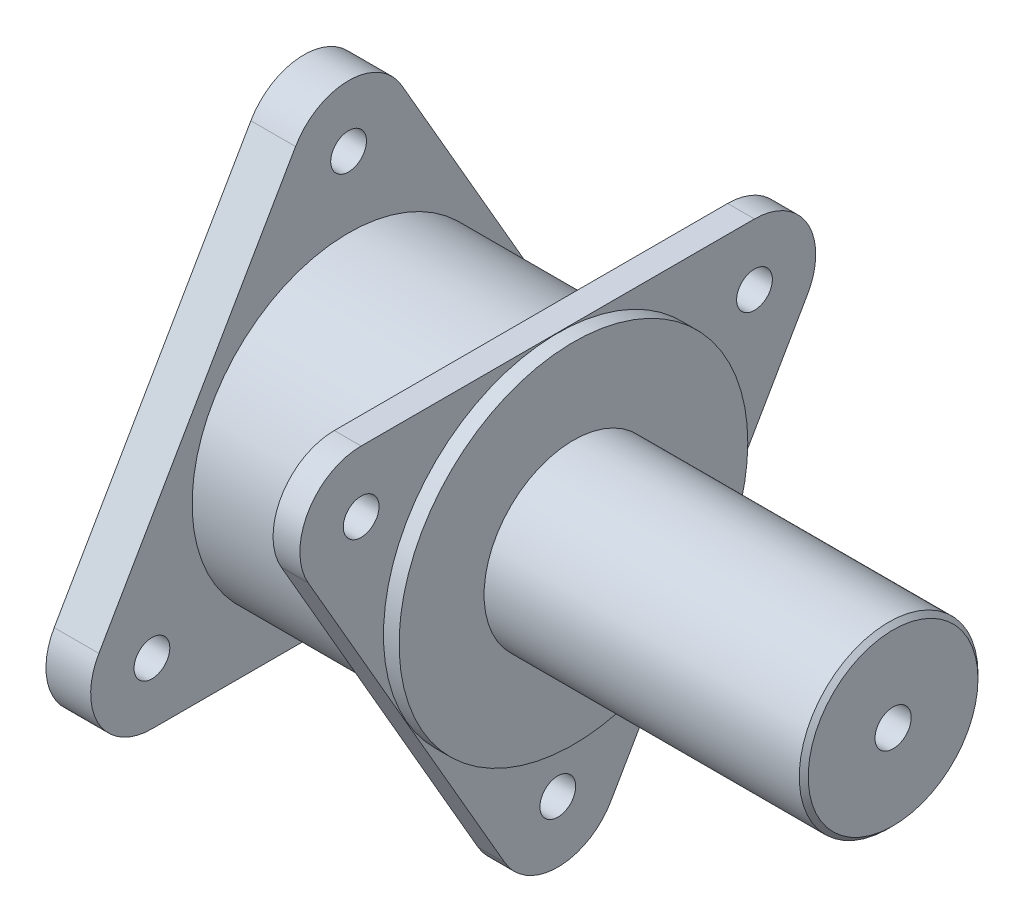
ISO-10303-21;
HEADER;
FILE_DESCRIPTION(('STEP AP214'),'2;1');
FILE_NAME('part.step','',(''),(''),'','','');
FILE_SCHEMA(('AUTOMOTIVE_DESIGN { 1 0 10303 214 1 1 1 1 }'));
ENDSEC;
DATA;
#1=APPLICATION_CONTEXT('core data for automotive mechanical design processes');
#2=APPLICATION_PROTOCOL_DEFINITION('international standard','automotive_design',2000,#1);
#3=PRODUCT_CONTEXT('',#1,'mechanical');
#4=PRODUCT('Part','Part','',(#3));
#5=PRODUCT_RELATED_PRODUCT_CATEGORY('part','',(#4));
#6=PRODUCT_DEFINITION_FORMATION('','',#4);
#7=PRODUCT_DEFINITION_CONTEXT('part definition',#1,'design');
#8=PRODUCT_DEFINITION('design','',#6,#7);
#9=PRODUCT_DEFINITION_SHAPE('','',#8);
#10=(LENGTH_UNIT() NAMED_UNIT(*) SI_UNIT(.MILLI.,.METRE.));
#11=(NAMED_UNIT(*) PLANE_ANGLE_UNIT() SI_UNIT($,.RADIAN.));
#12=(NAMED_UNIT(*) SI_UNIT($,.STERADIAN.) SOLID_ANGLE_UNIT());
#13=UNCERTAINTY_MEASURE_WITH_UNIT(LENGTH_MEASURE(1.E-05),#10,'distance_accuracy_value','');
#14=(GEOMETRIC_REPRESENTATION_CONTEXT(3) GLOBAL_UNCERTAINTY_ASSIGNED_CONTEXT((#13)) GLOBAL_UNIT_ASSIGNED_CONTEXT((#10,
#11,#12)) REPRESENTATION_CONTEXT('',''));
#15=CARTESIAN_POINT('',(0.,0.,0.));
#16=DIRECTION('',(0.,0.,1.));
#17=DIRECTION('',(1.,0.,0.));
#18=AXIS2_PLACEMENT_3D('',#15,#16,#17);
#19=CARTESIAN_POINT('',(10.,-25.3999999999981,43.9940905122478));
#20=DIRECTION('',(1.,0.,0.));
#21=DIRECTION('',(0.,0.,-1.));
#22=AXIS2_PLACEMENT_3D('',#19,#20,#21);
#23=PLANE('',#22);
#24=CARTESIAN_POINT('',(10.,0.,0.));
#25=DIRECTION('',(1.,0.,0.));
#26=DIRECTION('',(0.,0.,-1.));
#27=AXIS2_PLACEMENT_3D('',#24,#25,#26);
#28=CIRCLE('',#27,35.);
#29=CARTESIAN_POINT('',(10.,0.,-35.));
#30=VERTEX_POINT('',#29);
#31=EDGE_CURVE('E243',#30,#30,#28,.T.);
#32=ORIENTED_EDGE('',*,*,#31,.F.);
#33=EDGE_LOOP('',(#32));
#34=FACE_BOUND('',#33,.T.);
#35=CARTESIAN_POINT('',(10.,-25.3999999999981,-43.9940905122527));
#36=DIRECTION('',(1.,0.,0.));
#37=DIRECTION('',(0.,0.,-1.));
#38=AXIS2_PLACEMENT_3D('',#35,#36,#37);
#39=CIRCLE('',#38,4.00000000000278);
#40=CARTESIAN_POINT('',(10.,-25.3999999999981,-47.9940905122555));
#41=VERTEX_POINT('',#40);
#42=EDGE_CURVE('E228',#41,#41,#39,.T.);
#43=ORIENTED_EDGE('',*,*,#42,.F.);
#44=EDGE_LOOP('',(#43));
#45=FACE_BOUND('',#44,.T.);
#46=CARTESIAN_POINT('',(10.,-25.3999999999981,43.9940905122478));
#47=DIRECTION('',(1.,0.,0.));
#48=DIRECTION('',(0.,0.,-1.));
#49=AXIS2_PLACEMENT_3D('',#46,#47,#48);
#50=CIRCLE('',#49,13.6999999999999);
#51=CARTESIAN_POINT('',(10.,-18.5499999999976,55.8586385440946));
#52=VERTEX_POINT('',#51);
#53=CARTESIAN_POINT('',(10.,-39.0999999999976,43.9940905122478));
#54=VERTEX_POINT('',#53);
#55=EDGE_CURVE('E152',#52,#54,#50,.T.);
#56=ORIENTED_EDGE('',*,*,#55,.T.);
#57=DIRECTION('',(0.,0.,-1.));
#58=VECTOR('',#57,1.);
#59=CARTESIAN_POINT('',(10.,-39.0999999999976,43.9940905122478));
#60=LINE('',#59,#58);
#61=CARTESIAN_POINT('',(10.,-39.0999999999976,-43.9940905122487));
#62=VERTEX_POINT('',#61);
#63=EDGE_CURVE('E107',#54,#62,#60,.T.);
#64=ORIENTED_EDGE('',*,*,#63,.T.);
#65=CARTESIAN_POINT('',(10.,-25.3999999999976,-43.9940905122487));
#66=DIRECTION('',(1.,0.,0.));
#67=DIRECTION('',(0.,0.,-1.));
#68=AXIS2_PLACEMENT_3D('',#65,#66,#67);
#69=CIRCLE('',#68,13.7);
#70=CARTESIAN_POINT('',(10.,-18.5499999999975,-55.8586385440954));
#71=VERTEX_POINT('',#70);
#72=EDGE_CURVE('E123',#62,#71,#69,.T.);
#73=ORIENTED_EDGE('',*,*,#72,.T.);
#74=DIRECTION('',(0.,0.866025403784436,0.500000000000005));
#75=VECTOR('',#74,1.);
#76=CARTESIAN_POINT('',(10.,57.6500000000001,-11.8645480318468));
#77=LINE('',#76,#75);
#78=CARTESIAN_POINT('',(10.,57.6500000000001,-11.8645480318468));
#79=VERTEX_POINT('',#78);
#80=EDGE_CURVE('E117',#71,#79,#77,.T.);
#81=ORIENTED_EDGE('',*,*,#80,.T.);
#82=CARTESIAN_POINT('',(10.,50.8,0.));
#83=DIRECTION('',(1.,0.,0.));
#84=DIRECTION('',(0.,0.,-1.));
#85=AXIS2_PLACEMENT_3D('',#82,#83,#84);
#86=CIRCLE('',#85,13.7);
#87=CARTESIAN_POINT('',(10.,57.65,11.8645480318468));
#88=VERTEX_POINT('',#87);
#89=EDGE_CURVE('E121',#79,#88,#86,.T.);
#90=ORIENTED_EDGE('',*,*,#89,.T.);
#91=DIRECTION('',(0.,-0.86602540378444,0.499999999999998));
#92=VECTOR('',#91,1.);
#93=CARTESIAN_POINT('',(10.,-18.5499999999976,55.8586385440946));
#94=LINE('',#93,#92);
#95=EDGE_CURVE('E68',#88,#52,#94,.T.);
#96=ORIENTED_EDGE('',*,*,#95,.T.);
#97=EDGE_LOOP('',(#56,#64,#73,#81,#90,#96));
#98=FACE_BOUND('',#97,.T.);
#99=CARTESIAN_POINT('',(10.,50.8,0.));
#100=DIRECTION('',(1.,0.,0.));
#101=DIRECTION('',(0.,0.,-1.));
#102=AXIS2_PLACEMENT_3D('',#99,#100,#101);
#103=CIRCLE('',#102,4.);
#104=CARTESIAN_POINT('',(10.,50.8,-4.));
#105=VERTEX_POINT('',#104);
#106=EDGE_CURVE('E145',#105,#105,#103,.T.);
#107=ORIENTED_EDGE('',*,*,#106,.F.);
#108=EDGE_LOOP('',(#107));
#109=FACE_BOUND('',#108,.T.);
#110=CARTESIAN_POINT('',(10.,-25.4000000000019,43.9940905122462));
#111=DIRECTION('',(1.,0.,0.));
#112=DIRECTION('',(0.,0.,-1.));
#113=AXIS2_PLACEMENT_3D('',#110,#111,#112);
#114=CIRCLE('',#113,4.00000000000411);
#115=CARTESIAN_POINT('',(10.,-25.4000000000019,39.9940905122421));
#116=VERTEX_POINT('',#115);
#117=EDGE_CURVE('E234',#116,#116,#114,.T.);
#118=ORIENTED_EDGE('',*,*,#117,.F.);
#119=EDGE_LOOP('',(#118));
#120=FACE_BOUND('',#119,.T.);
#121=ADVANCED_FACE('F50',(#34,#45,#98,#109,#120),#23,.T.);
#122=CARTESIAN_POINT('',(0.,-25.3999999999981,43.9940905122478));
#123=DIRECTION('',(1.,0.,0.));
#124=DIRECTION('',(0.,0.,-1.));
#125=AXIS2_PLACEMENT_3D('',#122,#123,#124);
#126=PLANE('',#125);
#127=CARTESIAN_POINT('',(0.,0.,0.));
#128=DIRECTION('',(1.,0.,0.));
#129=DIRECTION('',(0.,0.,-1.));
#130=AXIS2_PLACEMENT_3D('',#127,#128,#129);
#131=CIRCLE('',#130,4.05);
#132=CARTESIAN_POINT('',(0.,0.,-4.05));
#133=VERTEX_POINT('',#132);
#134=EDGE_CURVE('E322',#133,#133,#131,.F.);
#135=ORIENTED_EDGE('',*,*,#134,.F.);
#136=EDGE_LOOP('',(#135));
#137=FACE_BOUND('',#136,.T.);
#138=CARTESIAN_POINT('',(0.,-25.3999999999981,43.9940905122478));
#139=DIRECTION('',(1.,0.,0.));
#140=DIRECTION('',(0.,0.,-1.));
#141=AXIS2_PLACEMENT_3D('',#138,#139,#140);
#142=CIRCLE('',#141,13.6999999999999);
#143=CARTESIAN_POINT('',(0.,-18.5499999999976,55.8586385440946));
#144=VERTEX_POINT('',#143);
#145=CARTESIAN_POINT('',(0.,-39.0999999999976,43.9940905122478));
#146=VERTEX_POINT('',#145);
#147=EDGE_CURVE('E141',#144,#146,#142,.T.);
#148=ORIENTED_EDGE('',*,*,#147,.F.);
#149=DIRECTION('',(0.,-0.86602540378444,0.499999999999998));
#150=VECTOR('',#149,1.);
#151=CARTESIAN_POINT('',(0.,-18.5499999999976,55.8586385440946));
#152=LINE('',#151,#150);
#153=CARTESIAN_POINT('',(0.,57.65,11.8645480318468));
#154=VERTEX_POINT('',#153);
#155=EDGE_CURVE('E98',#154,#144,#152,.T.);
#156=ORIENTED_EDGE('',*,*,#155,.F.);
#157=CARTESIAN_POINT('',(0.,50.8,0.));
#158=DIRECTION('',(1.,0.,0.));
#159=DIRECTION('',(0.,0.,-1.));
#160=AXIS2_PLACEMENT_3D('',#157,#158,#159);
#161=CIRCLE('',#160,13.7);
#162=CARTESIAN_POINT('',(0.,57.6500000000001,-11.8645480318468));
#163=VERTEX_POINT('',#162);
#164=EDGE_CURVE('E92',#163,#154,#161,.T.);
#165=ORIENTED_EDGE('',*,*,#164,.F.);
#166=DIRECTION('',(0.,0.866025403784436,0.500000000000005));
#167=VECTOR('',#166,1.);
#168=CARTESIAN_POINT('',(0.,57.6500000000001,-11.8645480318468));
#169=LINE('',#168,#167);
#170=CARTESIAN_POINT('',(0.,-18.5499999999975,-55.8586385440954));
#171=VERTEX_POINT('',#170);
#172=EDGE_CURVE('E131',#171,#163,#169,.T.);
#173=ORIENTED_EDGE('',*,*,#172,.F.);
#174=CARTESIAN_POINT('',(0.,-25.3999999999976,-43.9940905122487));
#175=DIRECTION('',(1.,0.,0.));
#176=DIRECTION('',(0.,0.,-1.));
#177=AXIS2_PLACEMENT_3D('',#174,#175,#176);
#178=CIRCLE('',#177,13.7);
#179=CARTESIAN_POINT('',(0.,-39.0999999999976,-43.9940905122487));
#180=VERTEX_POINT('',#179);
#181=EDGE_CURVE('E147',#180,#171,#178,.T.);
#182=ORIENTED_EDGE('',*,*,#181,.F.);
#183=DIRECTION('',(0.,0.,-1.));
#184=VECTOR('',#183,1.);
#185=CARTESIAN_POINT('',(0.,-39.0999999999976,43.9940905122478));
#186=LINE('',#185,#184);
#187=EDGE_CURVE('E144',#146,#180,#186,.T.);
#188=ORIENTED_EDGE('',*,*,#187,.F.);
#189=EDGE_LOOP('',(#148,#156,#165,#173,#182,#188));
#190=FACE_BOUND('',#189,.T.);
#191=CARTESIAN_POINT('',(0.,50.8,0.));
#192=DIRECTION('',(1.,0.,0.));
#193=DIRECTION('',(0.,0.,-1.));
#194=AXIS2_PLACEMENT_3D('',#191,#192,#193);
#195=CIRCLE('',#194,4.);
#196=CARTESIAN_POINT('',(0.,50.8,-4.));
#197=VERTEX_POINT('',#196);
#198=EDGE_CURVE('E225',#197,#197,#195,.T.);
#199=ORIENTED_EDGE('',*,*,#198,.T.);
#200=EDGE_LOOP('',(#199));
#201=FACE_BOUND('',#200,.T.);
#202=CARTESIAN_POINT('',(0.,-25.3999999999981,-43.9940905122527));
#203=DIRECTION('',(1.,0.,0.));
#204=DIRECTION('',(0.,0.,-1.));
#205=AXIS2_PLACEMENT_3D('',#202,#203,#204);
#206=CIRCLE('',#205,4.00000000000278);
#207=CARTESIAN_POINT('',(0.,-25.3999999999981,-47.9940905122555));
#208=VERTEX_POINT('',#207);
#209=EDGE_CURVE('E231',#208,#208,#206,.T.);
#210=ORIENTED_EDGE('',*,*,#209,.T.);
#211=EDGE_LOOP('',(#210));
#212=FACE_BOUND('',#211,.T.);
#213=CARTESIAN_POINT('',(0.,-25.4000000000019,43.9940905122462));
#214=DIRECTION('',(1.,0.,0.));
#215=DIRECTION('',(0.,0.,-1.));
#216=AXIS2_PLACEMENT_3D('',#213,#214,#215);
#217=CIRCLE('',#216,4.00000000000411);
#218=CARTESIAN_POINT('',(0.,-25.4000000000019,39.9940905122421));
#219=VERTEX_POINT('',#218);
#220=EDGE_CURVE('E237',#219,#219,#217,.T.);
#221=ORIENTED_EDGE('',*,*,#220,.T.);
#222=EDGE_LOOP('',(#221));
#223=FACE_BOUND('',#222,.T.);
#224=ADVANCED_FACE('F184',(#137,#190,#201,#212,#223),#126,.F.);
#225=CARTESIAN_POINT('',(10.,-25.3999999999981,43.9940905122478));
#226=DIRECTION('',(-1.,0.,0.));
#227=DIRECTION('',(0.,0.,1.));
#228=AXIS2_PLACEMENT_3D('',#225,#226,#227);
#229=CYLINDRICAL_SURFACE('',#228,13.6999999999999);
#230=ORIENTED_EDGE('',*,*,#147,.T.);
#231=DIRECTION('',(-1.,0.,0.));
#232=VECTOR('',#231,1.);
#233=CARTESIAN_POINT('',(10.,-39.0999999999976,43.9940905122478));
#234=LINE('',#233,#232);
#235=EDGE_CURVE('E159',#54,#146,#234,.T.);
#236=ORIENTED_EDGE('',*,*,#235,.F.);
#237=ORIENTED_EDGE('',*,*,#55,.F.);
#238=DIRECTION('',(-1.,0.,0.));
#239=VECTOR('',#238,1.);
#240=CARTESIAN_POINT('',(10.,-18.5499999999976,55.8586385440946));
#241=LINE('',#240,#239);
#242=EDGE_CURVE('E137',#52,#144,#241,.T.);
#243=ORIENTED_EDGE('',*,*,#242,.T.);
#244=EDGE_LOOP('',(#230,#236,#237,#243));
#245=FACE_BOUND('',#244,.T.);
#246=ADVANCED_FACE('F190',(#245),#229,.T.);
#247=CARTESIAN_POINT('',(10.,-39.0999999999976,43.9940905122478));
#248=DIRECTION('',(0.,1.,0.));
#249=DIRECTION('',(0.,0.,1.));
#250=AXIS2_PLACEMENT_3D('',#247,#248,#249);
#251=PLANE('',#250);
#252=ORIENTED_EDGE('',*,*,#187,.T.);
#253=DIRECTION('',(-1.,0.,0.));
#254=VECTOR('',#253,1.);
#255=CARTESIAN_POINT('',(10.,-39.0999999999976,-43.9940905122487));
#256=LINE('',#255,#254);
#257=EDGE_CURVE('E156',#62,#180,#256,.T.);
#258=ORIENTED_EDGE('',*,*,#257,.F.);
#259=ORIENTED_EDGE('',*,*,#63,.F.);
#260=ORIENTED_EDGE('',*,*,#235,.T.);
#261=EDGE_LOOP('',(#252,#258,#259,#260));
#262=FACE_BOUND('',#261,.T.);
#263=ADVANCED_FACE('F209',(#262),#251,.F.);
#264=CARTESIAN_POINT('',(10.,-25.3999999999976,-43.9940905122487));
#265=DIRECTION('',(-1.,0.,0.));
#266=DIRECTION('',(0.,0.,1.));
#267=AXIS2_PLACEMENT_3D('',#264,#265,#266);
#268=CYLINDRICAL_SURFACE('',#267,13.7);
#269=ORIENTED_EDGE('',*,*,#181,.T.);
#270=DIRECTION('',(-1.,0.,0.));
#271=VECTOR('',#270,1.);
#272=CARTESIAN_POINT('',(10.,-18.5499999999975,-55.8586385440954));
#273=LINE('',#272,#271);
#274=EDGE_CURVE('E132',#71,#171,#273,.T.);
#275=ORIENTED_EDGE('',*,*,#274,.F.);
#276=ORIENTED_EDGE('',*,*,#72,.F.);
#277=ORIENTED_EDGE('',*,*,#257,.T.);
#278=EDGE_LOOP('',(#269,#275,#276,#277));
#279=FACE_BOUND('',#278,.T.);
#280=ADVANCED_FACE('F206',(#279),#268,.T.);
#281=CARTESIAN_POINT('',(10.,57.6500000000001,-11.8645480318468));
#282=DIRECTION('',(0.,-0.500000000000005,0.866025403784436));
#283=DIRECTION('',(0.,-0.866025403784436,-0.500000000000005));
#284=AXIS2_PLACEMENT_3D('',#281,#282,#283);
#285=PLANE('',#284);
#286=ORIENTED_EDGE('',*,*,#172,.T.);
#287=DIRECTION('',(-1.,0.,0.));
#288=VECTOR('',#287,1.);
#289=CARTESIAN_POINT('',(10.,57.6500000000001,-11.8645480318468));
#290=LINE('',#289,#288);
#291=EDGE_CURVE('E128',#79,#163,#290,.T.);
#292=ORIENTED_EDGE('',*,*,#291,.F.);
#293=ORIENTED_EDGE('',*,*,#80,.F.);
#294=ORIENTED_EDGE('',*,*,#274,.T.);
#295=EDGE_LOOP('',(#286,#292,#293,#294));
#296=FACE_BOUND('',#295,.T.);
#297=ADVANCED_FACE('F129',(#296),#285,.F.);
#298=CARTESIAN_POINT('',(10.,50.8,0.));
#299=DIRECTION('',(-1.,0.,0.));
#300=DIRECTION('',(0.,0.,1.));
#301=AXIS2_PLACEMENT_3D('',#298,#299,#300);
#302=CYLINDRICAL_SURFACE('',#301,13.7);
#303=ORIENTED_EDGE('',*,*,#164,.T.);
#304=DIRECTION('',(-1.,0.,0.));
#305=VECTOR('',#304,1.);
#306=CARTESIAN_POINT('',(10.,57.65,11.8645480318468));
#307=LINE('',#306,#305);
#308=EDGE_CURVE('E133',#88,#154,#307,.T.);
#309=ORIENTED_EDGE('',*,*,#308,.F.);
#310=ORIENTED_EDGE('',*,*,#89,.F.);
#311=ORIENTED_EDGE('',*,*,#291,.T.);
#312=EDGE_LOOP('',(#303,#309,#310,#311));
#313=FACE_BOUND('',#312,.T.);
#314=ADVANCED_FACE('F135',(#313),#302,.T.);
#315=CARTESIAN_POINT('',(10.,-18.5499999999976,55.8586385440946));
#316=DIRECTION('',(0.,-0.499999999999998,-0.86602540378444));
#317=DIRECTION('',(0.,0.86602540378444,-0.499999999999998));
#318=AXIS2_PLACEMENT_3D('',#315,#316,#317);
#319=PLANE('',#318);
#320=ORIENTED_EDGE('',*,*,#155,.T.);
#321=ORIENTED_EDGE('',*,*,#242,.F.);
#322=ORIENTED_EDGE('',*,*,#95,.F.);
#323=ORIENTED_EDGE('',*,*,#308,.T.);
#324=EDGE_LOOP('',(#320,#321,#322,#323));
#325=FACE_BOUND('',#324,.T.);
#326=ADVANCED_FACE('F199',(#325),#319,.F.);
#327=CARTESIAN_POINT('',(10.,50.8,0.));
#328=DIRECTION('',(-1.,0.,0.));
#329=DIRECTION('',(0.,0.,1.));
#330=AXIS2_PLACEMENT_3D('',#327,#328,#329);
#331=CYLINDRICAL_SURFACE('',#330,4.);
#332=ORIENTED_EDGE('',*,*,#106,.T.);
#333=EDGE_LOOP('',(#332));
#334=FACE_BOUND('',#333,.T.);
#335=ORIENTED_EDGE('',*,*,#198,.F.);
#336=EDGE_LOOP('',(#335));
#337=FACE_BOUND('',#336,.T.);
#338=ADVANCED_FACE('F196',(#334,#337),#331,.F.);
#339=CARTESIAN_POINT('',(10.,-25.3999999999981,-43.9940905122527));
#340=DIRECTION('',(-1.,0.,0.));
#341=DIRECTION('',(0.,0.,1.));
#342=AXIS2_PLACEMENT_3D('',#339,#340,#341);
#343=CYLINDRICAL_SURFACE('',#342,4.00000000000278);
#344=ORIENTED_EDGE('',*,*,#42,.T.);
#345=EDGE_LOOP('',(#344));
#346=FACE_BOUND('',#345,.T.);
#347=ORIENTED_EDGE('',*,*,#209,.F.);
#348=EDGE_LOOP('',(#347));
#349=FACE_BOUND('',#348,.T.);
#350=ADVANCED_FACE('F393',(#346,#349),#343,.F.);
#351=CARTESIAN_POINT('',(10.,-25.4000000000019,43.9940905122462));
#352=DIRECTION('',(-1.,0.,0.));
#353=DIRECTION('',(0.,0.,1.));
#354=AXIS2_PLACEMENT_3D('',#351,#352,#353);
#355=CYLINDRICAL_SURFACE('',#354,4.00000000000411);
#356=ORIENTED_EDGE('',*,*,#117,.T.);
#357=EDGE_LOOP('',(#356));
#358=FACE_BOUND('',#357,.T.);
#359=ORIENTED_EDGE('',*,*,#220,.F.);
#360=EDGE_LOOP('',(#359));
#361=FACE_BOUND('',#360,.T.);
#362=ADVANCED_FACE('F390',(#358,#361),#355,.F.);
#363=CARTESIAN_POINT('',(50.8,0.,0.));
#364=DIRECTION('',(-1.,0.,0.));
#365=DIRECTION('',(0.,0.,1.));
#366=AXIS2_PLACEMENT_3D('',#363,#364,#365);
#367=CYLINDRICAL_SURFACE('',#366,35.);
#368=CARTESIAN_POINT('',(50.8,0.,0.));
#369=DIRECTION('',(1.,0.,0.));
#370=DIRECTION('',(0.,0.,-1.));
#371=AXIS2_PLACEMENT_3D('',#368,#369,#370);
#372=CIRCLE('',#371,35.);
#373=CARTESIAN_POINT('',(50.8,0.,-35.));
#374=VERTEX_POINT('',#373);
#375=EDGE_CURVE('E240',#374,#374,#372,.T.);
#376=ORIENTED_EDGE('',*,*,#375,.F.);
#377=EDGE_LOOP('',(#376));
#378=FACE_BOUND('',#377,.T.);
#379=ORIENTED_EDGE('',*,*,#31,.T.);
#380=EDGE_LOOP('',(#379));
#381=FACE_BOUND('',#380,.T.);
#382=ADVANCED_FACE('F360',(#378,#381),#367,.T.);
#383=CARTESIAN_POINT('',(56.8,25.3999999999968,43.9940905122474));
#384=DIRECTION('',(1.,0.,0.));
#385=DIRECTION('',(0.,0.,-1.));
#386=AXIS2_PLACEMENT_3D('',#383,#384,#385);
#387=PLANE('',#386);
#388=CARTESIAN_POINT('',(56.8,0.,0.));
#389=DIRECTION('',(1.,0.,0.));
#390=DIRECTION('',(0.,0.,-1.));
#391=AXIS2_PLACEMENT_3D('',#388,#389,#390);
#392=CIRCLE('',#391,39.);
#393=CARTESIAN_POINT('',(56.8,0.,-39.));
#394=VERTEX_POINT('',#393);
#395=EDGE_CURVE('E319',#394,#394,#392,.T.);
#396=ORIENTED_EDGE('',*,*,#395,.F.);
#397=EDGE_LOOP('',(#396));
#398=FACE_BOUND('',#397,.T.);
#399=CARTESIAN_POINT('',(56.8,-50.8,-4.31280489997456E-12));
#400=DIRECTION('',(1.,0.,0.));
#401=DIRECTION('',(0.,0.,-1.));
#402=AXIS2_PLACEMENT_3D('',#399,#400,#401);
#403=CIRCLE('',#402,4.00000000000446);
#404=CARTESIAN_POINT('',(56.8,-50.8,-4.00000000000878));
#405=VERTEX_POINT('',#404);
#406=EDGE_CURVE('E306',#405,#405,#403,.T.);
#407=ORIENTED_EDGE('',*,*,#406,.F.);
#408=EDGE_LOOP('',(#407));
#409=FACE_BOUND('',#408,.T.);
#410=CARTESIAN_POINT('',(56.8,25.3999999999968,43.9940905122474));
#411=DIRECTION('',(1.,0.,0.));
#412=DIRECTION('',(0.,0.,-1.));
#413=AXIS2_PLACEMENT_3D('',#410,#411,#412);
#414=CIRCLE('',#413,13.7);
#415=CARTESIAN_POINT('',(56.8,39.0999999999968,43.9940905122474));
#416=VERTEX_POINT('',#415);
#417=CARTESIAN_POINT('',(56.8,18.5499999999968,55.8586385440942));
#418=VERTEX_POINT('',#417);
#419=EDGE_CURVE('E270',#416,#418,#414,.T.);
#420=ORIENTED_EDGE('',*,*,#419,.T.);
#421=DIRECTION('',(0.,-0.866025403784439,-0.5));
#422=VECTOR('',#421,1.);
#423=CARTESIAN_POINT('',(56.8,18.5499999999968,55.8586385440942));
#424=LINE('',#423,#422);
#425=CARTESIAN_POINT('',(56.8,-57.6500000000005,11.8645480318463));
#426=VERTEX_POINT('',#425);
#427=EDGE_CURVE('E298',#418,#426,#424,.T.);
#428=ORIENTED_EDGE('',*,*,#427,.T.);
#429=CARTESIAN_POINT('',(56.8,-50.8000000000005,-4.9921538031284E-13));
#430=DIRECTION('',(1.,0.,0.));
#431=DIRECTION('',(0.,0.,-1.));
#432=AXIS2_PLACEMENT_3D('',#429,#430,#431);
#433=CIRCLE('',#432,13.7);
#434=CARTESIAN_POINT('',(56.8,-57.6500000000005,-11.8645480318473));
#435=VERTEX_POINT('',#434);
#436=EDGE_CURVE('E295',#426,#435,#433,.T.);
#437=ORIENTED_EDGE('',*,*,#436,.T.);
#438=DIRECTION('',(0.,0.866025403784439,-0.5));
#439=VECTOR('',#438,1.);
#440=CARTESIAN_POINT('',(56.8,18.5499999999968,-55.8586385440952));
#441=LINE('',#440,#439);
#442=CARTESIAN_POINT('',(56.8,18.5499999999968,-55.8586385440952));
#443=VERTEX_POINT('',#442);
#444=EDGE_CURVE('E292',#435,#443,#441,.T.);
#445=ORIENTED_EDGE('',*,*,#444,.T.);
#446=CARTESIAN_POINT('',(56.8,25.3999999999968,-43.9940905122484));
#447=DIRECTION('',(1.,0.,0.));
#448=DIRECTION('',(0.,0.,-1.));
#449=AXIS2_PLACEMENT_3D('',#446,#447,#448);
#450=CIRCLE('',#449,13.7);
#451=CARTESIAN_POINT('',(56.8,39.0999999999968,-43.9940905122484));
#452=VERTEX_POINT('',#451);
#453=EDGE_CURVE('E289',#443,#452,#450,.T.);
#454=ORIENTED_EDGE('',*,*,#453,.T.);
#455=DIRECTION('',(0.,0.,1.));
#456=VECTOR('',#455,1.);
#457=CARTESIAN_POINT('',(56.8,39.0999999999968,43.9940905122474));
#458=LINE('',#457,#456);
#459=EDGE_CURVE('E266',#452,#416,#458,.T.);
#460=ORIENTED_EDGE('',*,*,#459,.T.);
#461=EDGE_LOOP('',(#420,#428,#437,#445,#454,#460));
#462=FACE_BOUND('',#461,.T.);
#463=CARTESIAN_POINT('',(56.8,25.4000000000019,-43.9940905122506));
#464=DIRECTION('',(1.,0.,0.));
#465=DIRECTION('',(0.,0.,-1.));
#466=AXIS2_PLACEMENT_3D('',#463,#464,#465);
#467=CIRCLE('',#466,4.00000000000061);
#468=CARTESIAN_POINT('',(56.8,25.4000000000019,-47.9940905122512));
#469=VERTEX_POINT('',#468);
#470=EDGE_CURVE('E286',#469,#469,#467,.T.);
#471=ORIENTED_EDGE('',*,*,#470,.F.);
#472=EDGE_LOOP('',(#471));
#473=FACE_BOUND('',#472,.T.);
#474=CARTESIAN_POINT('',(56.8,25.3999999999968,43.9940905122474));
#475=DIRECTION('',(1.,0.,0.));
#476=DIRECTION('',(0.,0.,-1.));
#477=AXIS2_PLACEMENT_3D('',#474,#475,#476);
#478=CIRCLE('',#477,4.00000000000326);
#479=CARTESIAN_POINT('',(56.8,25.3999999999968,39.9940905122441));
#480=VERTEX_POINT('',#479);
#481=EDGE_CURVE('E312',#480,#480,#478,.T.);
#482=ORIENTED_EDGE('',*,*,#481,.F.);
#483=EDGE_LOOP('',(#482));
#484=FACE_BOUND('',#483,.T.);
#485=ADVANCED_FACE('F356',(#398,#409,#462,#473,#484),#387,.T.);
#486=CARTESIAN_POINT('',(50.8,25.3999999999968,43.9940905122474));
#487=DIRECTION('',(1.,0.,0.));
#488=DIRECTION('',(0.,0.,-1.));
#489=AXIS2_PLACEMENT_3D('',#486,#487,#488);
#490=PLANE('',#489);
#491=ORIENTED_EDGE('',*,*,#375,.T.);
#492=EDGE_LOOP('',(#491));
#493=FACE_BOUND('',#492,.T.);
#494=CARTESIAN_POINT('',(50.8,25.3999999999968,43.9940905122474));
#495=DIRECTION('',(1.,0.,0.));
#496=DIRECTION('',(0.,0.,-1.));
#497=AXIS2_PLACEMENT_3D('',#494,#495,#496);
#498=CIRCLE('',#497,13.7);
#499=CARTESIAN_POINT('',(50.8,39.0999999999968,43.9940905122474));
#500=VERTEX_POINT('',#499);
#501=CARTESIAN_POINT('',(50.8,18.5499999999968,55.8586385440942));
#502=VERTEX_POINT('',#501);
#503=EDGE_CURVE('E283',#500,#502,#498,.T.);
#504=ORIENTED_EDGE('',*,*,#503,.F.);
#505=DIRECTION('',(0.,0.,1.));
#506=VECTOR('',#505,1.);
#507=CARTESIAN_POINT('',(50.8,39.0999999999968,43.9940905122474));
#508=LINE('',#507,#506);
#509=CARTESIAN_POINT('',(50.8,39.0999999999968,-43.9940905122484));
#510=VERTEX_POINT('',#509);
#511=EDGE_CURVE('E267',#510,#500,#508,.T.);
#512=ORIENTED_EDGE('',*,*,#511,.F.);
#513=CARTESIAN_POINT('',(50.8,25.3999999999968,-43.9940905122484));
#514=DIRECTION('',(1.,0.,0.));
#515=DIRECTION('',(0.,0.,-1.));
#516=AXIS2_PLACEMENT_3D('',#513,#514,#515);
#517=CIRCLE('',#516,13.7);
#518=CARTESIAN_POINT('',(50.8,18.5499999999968,-55.8586385440952));
#519=VERTEX_POINT('',#518);
#520=EDGE_CURVE('E271',#519,#510,#517,.T.);
#521=ORIENTED_EDGE('',*,*,#520,.F.);
#522=DIRECTION('',(0.,0.866025403784439,-0.5));
#523=VECTOR('',#522,1.);
#524=CARTESIAN_POINT('',(50.8,18.5499999999968,-55.8586385440952));
#525=LINE('',#524,#523);
#526=CARTESIAN_POINT('',(50.8,-57.6500000000005,-11.8645480318473));
#527=VERTEX_POINT('',#526);
#528=EDGE_CURVE('E274',#527,#519,#525,.T.);
#529=ORIENTED_EDGE('',*,*,#528,.F.);
#530=CARTESIAN_POINT('',(50.8,-50.8000000000005,-4.9921538031284E-13));
#531=DIRECTION('',(1.,0.,0.));
#532=DIRECTION('',(0.,0.,-1.));
#533=AXIS2_PLACEMENT_3D('',#530,#531,#532);
#534=CIRCLE('',#533,13.7);
#535=CARTESIAN_POINT('',(50.8,-57.6500000000005,11.8645480318463));
#536=VERTEX_POINT('',#535);
#537=EDGE_CURVE('E277',#536,#527,#534,.T.);
#538=ORIENTED_EDGE('',*,*,#537,.F.);
#539=DIRECTION('',(0.,-0.866025403784439,-0.5));
#540=VECTOR('',#539,1.);
#541=CARTESIAN_POINT('',(50.8,18.5499999999968,55.8586385440942));
#542=LINE('',#541,#540);
#543=EDGE_CURVE('E280',#502,#536,#542,.T.);
#544=ORIENTED_EDGE('',*,*,#543,.F.);
#545=EDGE_LOOP('',(#504,#512,#521,#529,#538,#544));
#546=FACE_BOUND('',#545,.T.);
#547=CARTESIAN_POINT('',(50.8,25.4000000000019,-43.9940905122506));
#548=DIRECTION('',(1.,0.,0.));
#549=DIRECTION('',(0.,0.,-1.));
#550=AXIS2_PLACEMENT_3D('',#547,#548,#549);
#551=CIRCLE('',#550,4.00000000000061);
#552=CARTESIAN_POINT('',(50.8,25.4000000000019,-47.9940905122512));
#553=VERTEX_POINT('',#552);
#554=EDGE_CURVE('E303',#553,#553,#551,.T.);
#555=ORIENTED_EDGE('',*,*,#554,.T.);
#556=EDGE_LOOP('',(#555));
#557=FACE_BOUND('',#556,.T.);
#558=CARTESIAN_POINT('',(50.8,-50.8,-4.31280489997456E-12));
#559=DIRECTION('',(1.,0.,0.));
#560=DIRECTION('',(0.,0.,-1.));
#561=AXIS2_PLACEMENT_3D('',#558,#559,#560);
#562=CIRCLE('',#561,4.00000000000446);
#563=CARTESIAN_POINT('',(50.8,-50.8,-4.00000000000878));
#564=VERTEX_POINT('',#563);
#565=EDGE_CURVE('E309',#564,#564,#562,.T.);
#566=ORIENTED_EDGE('',*,*,#565,.T.);
#567=EDGE_LOOP('',(#566));
#568=FACE_BOUND('',#567,.T.);
#569=CARTESIAN_POINT('',(50.8,25.3999999999968,43.9940905122474));
#570=DIRECTION('',(1.,0.,0.));
#571=DIRECTION('',(0.,0.,-1.));
#572=AXIS2_PLACEMENT_3D('',#569,#570,#571);
#573=CIRCLE('',#572,4.00000000000326);
#574=CARTESIAN_POINT('',(50.8,25.3999999999968,39.9940905122441));
#575=VERTEX_POINT('',#574);
#576=EDGE_CURVE('E163',#575,#575,#573,.T.);
#577=ORIENTED_EDGE('',*,*,#576,.T.);
#578=EDGE_LOOP('',(#577));
#579=FACE_BOUND('',#578,.T.);
#580=ADVANCED_FACE('F359',(#493,#546,#557,#568,#579),#490,.F.);
#581=CARTESIAN_POINT('',(56.8,25.3999999999968,43.9940905122474));
#582=DIRECTION('',(-1.,0.,0.));
#583=DIRECTION('',(0.,0.,1.));
#584=AXIS2_PLACEMENT_3D('',#581,#582,#583);
#585=CYLINDRICAL_SURFACE('',#584,13.7);
#586=ORIENTED_EDGE('',*,*,#503,.T.);
#587=DIRECTION('',(-1.,0.,0.));
#588=VECTOR('',#587,1.);
#589=CARTESIAN_POINT('',(56.8,18.5499999999968,55.8586385440942));
#590=LINE('',#589,#588);
#591=EDGE_CURVE('E246',#418,#502,#590,.T.);
#592=ORIENTED_EDGE('',*,*,#591,.F.);
#593=ORIENTED_EDGE('',*,*,#419,.F.);
#594=DIRECTION('',(-1.,0.,0.));
#595=VECTOR('',#594,1.);
#596=CARTESIAN_POINT('',(56.8,39.0999999999968,43.9940905122474));
#597=LINE('',#596,#595);
#598=EDGE_CURVE('E263',#416,#500,#597,.T.);
#599=ORIENTED_EDGE('',*,*,#598,.T.);
#600=EDGE_LOOP('',(#586,#592,#593,#599));
#601=FACE_BOUND('',#600,.T.);
#602=ADVANCED_FACE('F364',(#601),#585,.T.);
#603=CARTESIAN_POINT('',(56.8,18.5499999999968,55.8586385440942));
#604=DIRECTION('',(0.,0.5,-0.866025403784439));
#605=DIRECTION('',(0.,0.866025403784439,0.5));
#606=AXIS2_PLACEMENT_3D('',#603,#604,#605);
#607=PLANE('',#606);
#608=ORIENTED_EDGE('',*,*,#543,.T.);
#609=DIRECTION('',(-1.,0.,0.));
#610=VECTOR('',#609,1.);
#611=CARTESIAN_POINT('',(56.8,-57.6500000000005,11.8645480318463));
#612=LINE('',#611,#610);
#613=EDGE_CURVE('E251',#426,#536,#612,.T.);
#614=ORIENTED_EDGE('',*,*,#613,.F.);
#615=ORIENTED_EDGE('',*,*,#427,.F.);
#616=ORIENTED_EDGE('',*,*,#591,.T.);
#617=EDGE_LOOP('',(#608,#614,#615,#616));
#618=FACE_BOUND('',#617,.T.);
#619=ADVANCED_FACE('F380',(#618),#607,.F.);
#620=CARTESIAN_POINT('',(56.8,-50.8000000000005,-4.9921538031284E-13));
#621=DIRECTION('',(-1.,0.,0.));
#622=DIRECTION('',(0.,0.,1.));
#623=AXIS2_PLACEMENT_3D('',#620,#621,#622);
#624=CYLINDRICAL_SURFACE('',#623,13.7);
#625=ORIENTED_EDGE('',*,*,#537,.T.);
#626=DIRECTION('',(-1.,0.,0.));
#627=VECTOR('',#626,1.);
#628=CARTESIAN_POINT('',(56.8,-57.6500000000005,-11.8645480318473));
#629=LINE('',#628,#627);
#630=EDGE_CURVE('E254',#435,#527,#629,.T.);
#631=ORIENTED_EDGE('',*,*,#630,.F.);
#632=ORIENTED_EDGE('',*,*,#436,.F.);
#633=ORIENTED_EDGE('',*,*,#613,.T.);
#634=EDGE_LOOP('',(#625,#631,#632,#633));
#635=FACE_BOUND('',#634,.T.);
#636=ADVANCED_FACE('F376',(#635),#624,.T.);
#637=CARTESIAN_POINT('',(56.8,18.5499999999968,-55.8586385440952));
#638=DIRECTION('',(0.,0.5,0.866025403784439));
#639=DIRECTION('',(0.,-0.866025403784439,0.5));
#640=AXIS2_PLACEMENT_3D('',#637,#638,#639);
#641=PLANE('',#640);
#642=ORIENTED_EDGE('',*,*,#528,.T.);
#643=DIRECTION('',(-1.,0.,0.));
#644=VECTOR('',#643,1.);
#645=CARTESIAN_POINT('',(56.8,18.5499999999968,-55.8586385440952));
#646=LINE('',#645,#644);
#647=EDGE_CURVE('E257',#443,#519,#646,.T.);
#648=ORIENTED_EDGE('',*,*,#647,.F.);
#649=ORIENTED_EDGE('',*,*,#444,.F.);
#650=ORIENTED_EDGE('',*,*,#630,.T.);
#651=EDGE_LOOP('',(#642,#648,#649,#650));
#652=FACE_BOUND('',#651,.T.);
#653=ADVANCED_FACE('F372',(#652),#641,.F.);
#654=CARTESIAN_POINT('',(56.8,25.3999999999968,-43.9940905122484));
#655=DIRECTION('',(-1.,0.,0.));
#656=DIRECTION('',(0.,0.,1.));
#657=AXIS2_PLACEMENT_3D('',#654,#655,#656);
#658=CYLINDRICAL_SURFACE('',#657,13.7);
#659=ORIENTED_EDGE('',*,*,#520,.T.);
#660=DIRECTION('',(-1.,0.,0.));
#661=VECTOR('',#660,1.);
#662=CARTESIAN_POINT('',(56.8,39.0999999999968,-43.9940905122484));
#663=LINE('',#662,#661);
#664=EDGE_CURVE('E260',#452,#510,#663,.T.);
#665=ORIENTED_EDGE('',*,*,#664,.F.);
#666=ORIENTED_EDGE('',*,*,#453,.F.);
#667=ORIENTED_EDGE('',*,*,#647,.T.);
#668=EDGE_LOOP('',(#659,#665,#666,#667));
#669=FACE_BOUND('',#668,.T.);
#670=ADVANCED_FACE('F368',(#669),#658,.T.);
#671=CARTESIAN_POINT('',(56.8,39.0999999999968,43.9940905122474));
#672=DIRECTION('',(0.,-1.,0.));
#673=DIRECTION('',(0.,0.,-1.));
#674=AXIS2_PLACEMENT_3D('',#671,#672,#673);
#675=PLANE('',#674);
#676=ORIENTED_EDGE('',*,*,#511,.T.);
#677=ORIENTED_EDGE('',*,*,#598,.F.);
#678=ORIENTED_EDGE('',*,*,#459,.F.);
#679=ORIENTED_EDGE('',*,*,#664,.T.);
#680=EDGE_LOOP('',(#676,#677,#678,#679));
#681=FACE_BOUND('',#680,.T.);
#682=ADVANCED_FACE('F354',(#681),#675,.F.);
#683=CARTESIAN_POINT('',(56.8,25.4000000000019,-43.9940905122506));
#684=DIRECTION('',(-1.,0.,0.));
#685=DIRECTION('',(0.,0.,1.));
#686=AXIS2_PLACEMENT_3D('',#683,#684,#685);
#687=CYLINDRICAL_SURFACE('',#686,4.00000000000061);
#688=ORIENTED_EDGE('',*,*,#470,.T.);
#689=EDGE_LOOP('',(#688));
#690=FACE_BOUND('',#689,.T.);
#691=ORIENTED_EDGE('',*,*,#554,.F.);
#692=EDGE_LOOP('',(#691));
#693=FACE_BOUND('',#692,.T.);
#694=ADVANCED_FACE('F350',(#690,#693),#687,.F.);
#695=CARTESIAN_POINT('',(56.8,-50.8,-4.31280489997456E-12));
#696=DIRECTION('',(-1.,0.,0.));
#697=DIRECTION('',(0.,0.,1.));
#698=AXIS2_PLACEMENT_3D('',#695,#696,#697);
#699=CYLINDRICAL_SURFACE('',#698,4.00000000000446);
#700=ORIENTED_EDGE('',*,*,#406,.T.);
#701=EDGE_LOOP('',(#700));
#702=FACE_BOUND('',#701,.T.);
#703=ORIENTED_EDGE('',*,*,#565,.F.);
#704=EDGE_LOOP('',(#703));
#705=FACE_BOUND('',#704,.T.);
#706=ADVANCED_FACE('F346',(#702,#705),#699,.F.);
#707=CARTESIAN_POINT('',(56.8,25.3999999999968,43.9940905122474));
#708=DIRECTION('',(-1.,0.,0.));
#709=DIRECTION('',(0.,0.,1.));
#710=AXIS2_PLACEMENT_3D('',#707,#708,#709);
#711=CYLINDRICAL_SURFACE('',#710,4.00000000000326);
#712=ORIENTED_EDGE('',*,*,#481,.T.);
#713=EDGE_LOOP('',(#712));
#714=FACE_BOUND('',#713,.T.);
#715=ORIENTED_EDGE('',*,*,#576,.F.);
#716=EDGE_LOOP('',(#715));
#717=FACE_BOUND('',#716,.T.);
#718=ADVANCED_FACE('F343',(#714,#717),#711,.F.);
#719=CARTESIAN_POINT('',(60.3,0.,0.));
#720=DIRECTION('',(-1.,0.,0.));
#721=DIRECTION('',(0.,0.,1.));
#722=AXIS2_PLACEMENT_3D('',#719,#720,#721);
#723=CYLINDRICAL_SURFACE('',#722,39.);
#724=CARTESIAN_POINT('',(60.3,0.,0.));
#725=DIRECTION('',(1.,0.,0.));
#726=DIRECTION('',(0.,0.,-1.));
#727=AXIS2_PLACEMENT_3D('',#724,#725,#726);
#728=CIRCLE('',#727,39.);
#729=CARTESIAN_POINT('',(60.3,0.,-39.));
#730=VERTEX_POINT('',#729);
#731=EDGE_CURVE('E164',#730,#730,#728,.T.);
#732=ORIENTED_EDGE('',*,*,#731,.F.);
#733=EDGE_LOOP('',(#732));
#734=FACE_BOUND('',#733,.T.);
#735=ORIENTED_EDGE('',*,*,#395,.T.);
#736=EDGE_LOOP('',(#735));
#737=FACE_BOUND('',#736,.T.);
#738=ADVANCED_FACE('F338',(#734,#737),#723,.T.);
#739=CARTESIAN_POINT('',(60.3,0.,0.));
#740=DIRECTION('',(1.,0.,0.));
#741=DIRECTION('',(0.,0.,-1.));
#742=AXIS2_PLACEMENT_3D('',#739,#740,#741);
#743=PLANE('',#742);
#744=CARTESIAN_POINT('',(60.3,0.,0.));
#745=DIRECTION('',(1.,0.,0.));
#746=DIRECTION('',(0.,0.,-1.));
#747=AXIS2_PLACEMENT_3D('',#744,#745,#746);
#748=CIRCLE('',#747,19.993);
#749=CARTESIAN_POINT('',(60.3,0.,-19.993));
#750=VERTEX_POINT('',#749);
#751=EDGE_CURVE('E161',#750,#750,#748,.T.);
#752=ORIENTED_EDGE('',*,*,#751,.F.);
#753=EDGE_LOOP('',(#752));
#754=FACE_BOUND('',#753,.T.);
#755=ORIENTED_EDGE('',*,*,#731,.T.);
#756=EDGE_LOOP('',(#755));
#757=FACE_BOUND('',#756,.T.);
#758=ADVANCED_FACE('F333',(#754,#757),#743,.T.);
#759=CARTESIAN_POINT('',(131.8,0.,0.));
#760=DIRECTION('',(1.,0.,0.));
#761=DIRECTION('',(0.,0.,-1.));
#762=AXIS2_PLACEMENT_3D('',#759,#760,#761);
#763=PLANE('',#762);
#764=CARTESIAN_POINT('',(131.8,0.,0.));
#765=DIRECTION('',(1.,0.,0.));
#766=DIRECTION('',(0.,0.,-1.));
#767=AXIS2_PLACEMENT_3D('',#764,#765,#766);
#768=CIRCLE('',#767,4.05);
#769=CARTESIAN_POINT('',(131.8,0.,-4.05));
#770=VERTEX_POINT('',#769);
#771=EDGE_CURVE('E327',#770,#770,#768,.T.);
#772=ORIENTED_EDGE('',*,*,#771,.F.);
#773=EDGE_LOOP('',(#772));
#774=FACE_BOUND('',#773,.T.);
#775=CARTESIAN_POINT('',(131.8,0.,0.));
#776=DIRECTION('',(1.,0.,0.));
#777=DIRECTION('',(0.,0.,-1.));
#778=AXIS2_PLACEMENT_3D('',#775,#776,#777);
#779=CIRCLE('',#778,18.993);
#780=CARTESIAN_POINT('',(131.8,0.,-18.993));
#781=VERTEX_POINT('',#780);
#782=EDGE_CURVE('E60',#781,#781,#779,.T.);
#783=ORIENTED_EDGE('',*,*,#782,.T.);
#784=EDGE_LOOP('',(#783));
#785=FACE_BOUND('',#784,.T.);
#786=ADVANCED_FACE('F168',(#774,#785),#763,.T.);
#787=CARTESIAN_POINT('',(131.8,0.,0.));
#788=DIRECTION('',(-1.,0.,0.));
#789=DIRECTION('',(0.,0.,1.));
#790=AXIS2_PLACEMENT_3D('',#787,#788,#789);
#791=CYLINDRICAL_SURFACE('',#790,19.993);
#792=CARTESIAN_POINT('',(130.8,0.,0.));
#793=DIRECTION('',(1.,0.,0.));
#794=DIRECTION('',(0.,0.,-1.));
#795=AXIS2_PLACEMENT_3D('',#792,#793,#794);
#796=CIRCLE('',#795,19.993);
#797=CARTESIAN_POINT('',(130.8,0.,-19.993));
#798=VERTEX_POINT('',#797);
#799=EDGE_CURVE('E13',#798,#798,#796,.F.);
#800=ORIENTED_EDGE('',*,*,#799,.T.);
#801=EDGE_LOOP('',(#800));
#802=FACE_BOUND('',#801,.T.);
#803=ORIENTED_EDGE('',*,*,#751,.T.);
#804=EDGE_LOOP('',(#803));
#805=FACE_BOUND('',#804,.T.);
#806=ADVANCED_FACE('F172',(#802,#805),#791,.T.);
#807=CARTESIAN_POINT('',(131.8,0.,0.));
#808=DIRECTION('',(-1.,0.,0.));
#809=DIRECTION('',(0.,0.,1.));
#810=AXIS2_PLACEMENT_3D('',#807,#808,#809);
#811=CONICAL_SURFACE('',#810,18.993,0.785398163397455);
#812=ORIENTED_EDGE('',*,*,#799,.F.);
#813=EDGE_LOOP('',(#812));
#814=FACE_BOUND('',#813,.T.);
#815=ORIENTED_EDGE('',*,*,#782,.F.);
#816=EDGE_LOOP('',(#815));
#817=FACE_BOUND('',#816,.T.);
#818=ADVANCED_FACE('F53',(#814,#817),#811,.T.);
#819=CARTESIAN_POINT('',(-11.4551298552221,0.,0.));
#820=DIRECTION('',(1.,0.,0.));
#821=DIRECTION('',(0.,0.,-1.));
#822=AXIS2_PLACEMENT_3D('',#819,#820,#821);
#823=CYLINDRICAL_SURFACE('',#822,4.05);
#824=ORIENTED_EDGE('',*,*,#134,.T.);
#825=EDGE_LOOP('',(#824));
#826=FACE_BOUND('',#825,.T.);
#827=ORIENTED_EDGE('',*,*,#771,.T.);
#828=EDGE_LOOP('',(#827));
#829=FACE_BOUND('',#828,.T.);
#830=ADVANCED_FACE('F171',(#826,#829),#823,.F.);
#831=CLOSED_SHELL('',(#121,#224,#246,#263,#280,#297,#314,#326,#338,#350,#362,#382,#485,#580,
#602,#619,#636,#653,#670,#682,#694,#706,#718,#738,#758,#786,#806,#818,#830));
#832=MANIFOLD_SOLID_BREP('B2',#831);
#833=ADVANCED_BREP_SHAPE_REPRESENTATION('',(#18,#832),#14);
#834=SHAPE_DEFINITION_REPRESENTATION(#9,#833);
ENDSEC;
END-ISO-10303-21;
